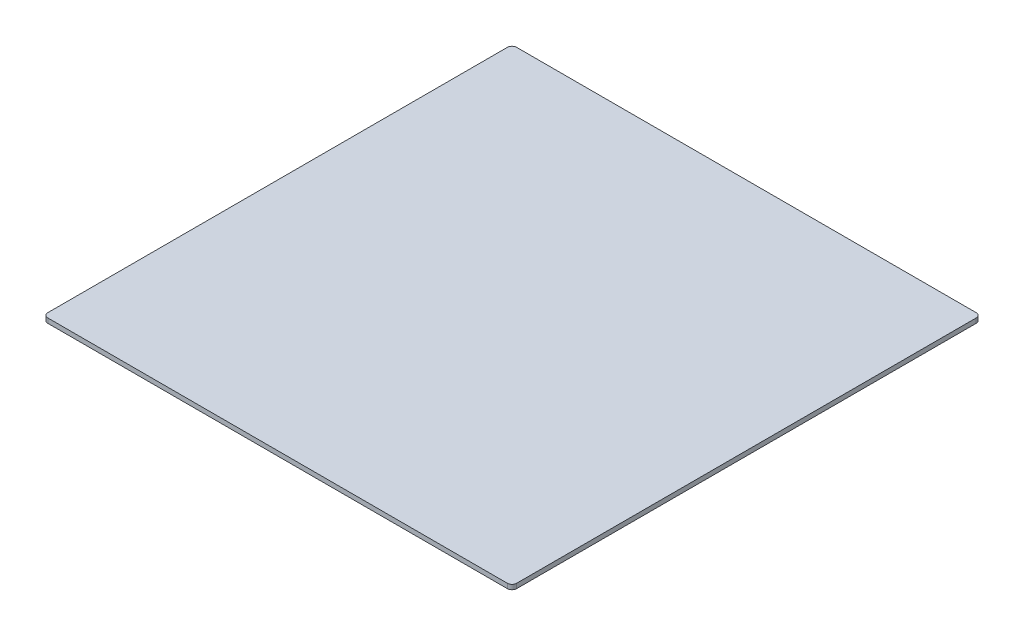
ISO-10303-21;
HEADER;
FILE_DESCRIPTION(('STEP AP214'),'2;1');
FILE_NAME('part.step','',(''),(''),'','','');
FILE_SCHEMA(('AUTOMOTIVE_DESIGN { 1 0 10303 214 1 1 1 1 }'));
ENDSEC;
DATA;
#1=APPLICATION_CONTEXT('core data for automotive mechanical design processes');
#2=APPLICATION_PROTOCOL_DEFINITION('international standard','automotive_design',2000,#1);
#3=PRODUCT_CONTEXT('',#1,'mechanical');
#4=PRODUCT('Part','Part','',(#3));
#5=PRODUCT_RELATED_PRODUCT_CATEGORY('part','',(#4));
#6=PRODUCT_DEFINITION_FORMATION('','',#4);
#7=PRODUCT_DEFINITION_CONTEXT('part definition',#1,'design');
#8=PRODUCT_DEFINITION('design','',#6,#7);
#9=PRODUCT_DEFINITION_SHAPE('','',#8);
#10=(LENGTH_UNIT() NAMED_UNIT(*) SI_UNIT(.MILLI.,.METRE.));
#11=(NAMED_UNIT(*) PLANE_ANGLE_UNIT() SI_UNIT($,.RADIAN.));
#12=(NAMED_UNIT(*) SI_UNIT($,.STERADIAN.) SOLID_ANGLE_UNIT());
#13=UNCERTAINTY_MEASURE_WITH_UNIT(LENGTH_MEASURE(1.E-05),#10,'distance_accuracy_value','');
#14=(GEOMETRIC_REPRESENTATION_CONTEXT(3) GLOBAL_UNCERTAINTY_ASSIGNED_CONTEXT((#13)) GLOBAL_UNIT_ASSIGNED_CONTEXT((#10,
#11,#12)) REPRESENTATION_CONTEXT('',''));
#15=CARTESIAN_POINT('',(0.,0.,0.));
#16=DIRECTION('',(0.,0.,1.));
#17=DIRECTION('',(1.,0.,0.));
#18=AXIS2_PLACEMENT_3D('',#15,#16,#17);
#19=CARTESIAN_POINT('',(58.1949219003437,1.,-20.4453938539141));
#20=DIRECTION('',(0.,-1.,0.));
#21=DIRECTION('',(0.,0.,-1.));
#22=AXIS2_PLACEMENT_3D('',#19,#20,#21);
#23=CYLINDRICAL_SURFACE('',#22,1.);
#24=CARTESIAN_POINT('',(58.1949219003437,0.,-20.4453938539141));
#25=DIRECTION('',(0.,1.,0.));
#26=DIRECTION('',(0.,0.,1.));
#27=AXIS2_PLACEMENT_3D('',#24,#25,#26);
#28=CIRCLE('',#27,1.);
#29=CARTESIAN_POINT('',(58.1949219003437,0.,-19.4453938539141));
#30=VERTEX_POINT('',#29);
#31=CARTESIAN_POINT('',(59.1949219003437,0.,-20.4453938539141));
#32=VERTEX_POINT('',#31);
#33=EDGE_CURVE('E128',#30,#32,#28,.T.);
#34=ORIENTED_EDGE('',*,*,#33,.T.);
#35=DIRECTION('',(0.,-1.,0.));
#36=VECTOR('',#35,1.);
#37=CARTESIAN_POINT('',(59.1949219003437,1.,-20.4453938539141));
#38=LINE('',#37,#36);
#39=CARTESIAN_POINT('',(59.1949219003437,1.,-20.4453938539141));
#40=VERTEX_POINT('',#39);
#41=EDGE_CURVE('E11',#40,#32,#38,.T.);
#42=ORIENTED_EDGE('',*,*,#41,.F.);
#43=CARTESIAN_POINT('',(58.1949219003437,1.,-20.4453938539141));
#44=DIRECTION('',(0.,1.,0.));
#45=DIRECTION('',(0.,0.,1.));
#46=AXIS2_PLACEMENT_3D('',#43,#44,#45);
#47=CIRCLE('',#46,1.);
#48=CARTESIAN_POINT('',(58.1949219003437,1.,-19.4453938539141));
#49=VERTEX_POINT('',#48);
#50=EDGE_CURVE('E142',#49,#40,#47,.T.);
#51=ORIENTED_EDGE('',*,*,#50,.F.);
#52=DIRECTION('',(0.,-1.,0.));
#53=VECTOR('',#52,1.);
#54=CARTESIAN_POINT('',(58.1949219003437,1.,-19.4453938539141));
#55=LINE('',#54,#53);
#56=EDGE_CURVE('E124',#49,#30,#55,.T.);
#57=ORIENTED_EDGE('',*,*,#56,.T.);
#58=EDGE_LOOP('',(#34,#42,#51,#57));
#59=FACE_BOUND('',#58,.T.);
#60=ADVANCED_FACE('F32',(#59),#23,.T.);
#61=CARTESIAN_POINT('',(59.1949219003437,1.,-118.445393853914));
#62=DIRECTION('',(-1.,0.,0.));
#63=DIRECTION('',(0.,0.,1.));
#64=AXIS2_PLACEMENT_3D('',#61,#62,#63);
#65=PLANE('',#64);
#66=DIRECTION('',(0.,0.,-1.));
#67=VECTOR('',#66,1.);
#68=CARTESIAN_POINT('',(59.1949219003437,0.,-118.445393853914));
#69=LINE('',#68,#67);
#70=CARTESIAN_POINT('',(59.1949219003437,0.,-118.445393853914));
#71=VERTEX_POINT('',#70);
#72=EDGE_CURVE('E131',#32,#71,#69,.T.);
#73=ORIENTED_EDGE('',*,*,#72,.T.);
#74=DIRECTION('',(0.,-1.,0.));
#75=VECTOR('',#74,1.);
#76=CARTESIAN_POINT('',(59.1949219003437,1.,-118.445393853914));
#77=LINE('',#76,#75);
#78=CARTESIAN_POINT('',(59.1949219003437,1.,-118.445393853914));
#79=VERTEX_POINT('',#78);
#80=EDGE_CURVE('E40',#79,#71,#77,.T.);
#81=ORIENTED_EDGE('',*,*,#80,.F.);
#82=DIRECTION('',(0.,0.,-1.));
#83=VECTOR('',#82,1.);
#84=CARTESIAN_POINT('',(59.1949219003437,1.,-118.445393853914));
#85=LINE('',#84,#83);
#86=EDGE_CURVE('E91',#40,#79,#85,.T.);
#87=ORIENTED_EDGE('',*,*,#86,.F.);
#88=ORIENTED_EDGE('',*,*,#41,.T.);
#89=EDGE_LOOP('',(#73,#81,#87,#88));
#90=FACE_BOUND('',#89,.T.);
#91=ADVANCED_FACE('F177',(#90),#65,.F.);
#92=CARTESIAN_POINT('',(58.1949219003437,1.,-118.445393853914));
#93=DIRECTION('',(0.,-1.,0.));
#94=DIRECTION('',(0.,0.,-1.));
#95=AXIS2_PLACEMENT_3D('',#92,#93,#94);
#96=CYLINDRICAL_SURFACE('',#95,1.);
#97=CARTESIAN_POINT('',(58.1949219003437,0.,-118.445393853914));
#98=DIRECTION('',(0.,1.,0.));
#99=DIRECTION('',(0.,0.,-1.));
#100=AXIS2_PLACEMENT_3D('',#97,#98,#99);
#101=CIRCLE('',#100,1.);
#102=CARTESIAN_POINT('',(58.1949219003437,0.,-119.445393853914));
#103=VERTEX_POINT('',#102);
#104=EDGE_CURVE('E133',#71,#103,#101,.T.);
#105=ORIENTED_EDGE('',*,*,#104,.T.);
#106=DIRECTION('',(0.,-1.,0.));
#107=VECTOR('',#106,1.);
#108=CARTESIAN_POINT('',(58.1949219003437,1.,-119.445393853914));
#109=LINE('',#108,#107);
#110=CARTESIAN_POINT('',(58.1949219003437,1.,-119.445393853914));
#111=VERTEX_POINT('',#110);
#112=EDGE_CURVE('E149',#111,#103,#109,.T.);
#113=ORIENTED_EDGE('',*,*,#112,.F.);
#114=CARTESIAN_POINT('',(58.1949219003437,1.,-118.445393853914));
#115=DIRECTION('',(0.,1.,0.));
#116=DIRECTION('',(0.,0.,-1.));
#117=AXIS2_PLACEMENT_3D('',#114,#115,#116);
#118=CIRCLE('',#117,1.);
#119=EDGE_CURVE('E157',#79,#111,#118,.T.);
#120=ORIENTED_EDGE('',*,*,#119,.F.);
#121=ORIENTED_EDGE('',*,*,#80,.T.);
#122=EDGE_LOOP('',(#105,#113,#120,#121));
#123=FACE_BOUND('',#122,.T.);
#124=ADVANCED_FACE('F155',(#123),#96,.T.);
#125=CARTESIAN_POINT('',(-39.8050780996563,1.,-119.445393853914));
#126=DIRECTION('',(0.,0.,1.));
#127=DIRECTION('',(1.,0.,0.));
#128=AXIS2_PLACEMENT_3D('',#125,#126,#127);
#129=PLANE('',#128);
#130=DIRECTION('',(-1.,0.,0.));
#131=VECTOR('',#130,1.);
#132=CARTESIAN_POINT('',(-39.8050780996563,0.,-119.445393853914));
#133=LINE('',#132,#131);
#134=CARTESIAN_POINT('',(-39.8050780996563,0.,-119.445393853914));
#135=VERTEX_POINT('',#134);
#136=EDGE_CURVE('E135',#103,#135,#133,.T.);
#137=ORIENTED_EDGE('',*,*,#136,.T.);
#138=DIRECTION('',(0.,-1.,0.));
#139=VECTOR('',#138,1.);
#140=CARTESIAN_POINT('',(-39.8050780996563,1.,-119.445393853914));
#141=LINE('',#140,#139);
#142=CARTESIAN_POINT('',(-39.8050780996563,1.,-119.445393853914));
#143=VERTEX_POINT('',#142);
#144=EDGE_CURVE('E146',#143,#135,#141,.T.);
#145=ORIENTED_EDGE('',*,*,#144,.F.);
#146=DIRECTION('',(-1.,0.,0.));
#147=VECTOR('',#146,1.);
#148=CARTESIAN_POINT('',(-39.8050780996563,1.,-119.445393853914));
#149=LINE('',#148,#147);
#150=EDGE_CURVE('E169',#111,#143,#149,.T.);
#151=ORIENTED_EDGE('',*,*,#150,.F.);
#152=ORIENTED_EDGE('',*,*,#112,.T.);
#153=EDGE_LOOP('',(#137,#145,#151,#152));
#154=FACE_BOUND('',#153,.T.);
#155=ADVANCED_FACE('F165',(#154),#129,.F.);
#156=CARTESIAN_POINT('',(-39.8050780996563,1.,-118.445393853914));
#157=DIRECTION('',(0.,-1.,0.));
#158=DIRECTION('',(0.,0.,-1.));
#159=AXIS2_PLACEMENT_3D('',#156,#157,#158);
#160=CYLINDRICAL_SURFACE('',#159,1.);
#161=CARTESIAN_POINT('',(-39.8050780996563,0.,-118.445393853914));
#162=DIRECTION('',(0.,1.,0.));
#163=DIRECTION('',(0.,0.,1.));
#164=AXIS2_PLACEMENT_3D('',#161,#162,#163);
#165=CIRCLE('',#164,1.);
#166=CARTESIAN_POINT('',(-40.8050780996563,0.,-118.445393853914));
#167=VERTEX_POINT('',#166);
#168=EDGE_CURVE('E137',#135,#167,#165,.T.);
#169=ORIENTED_EDGE('',*,*,#168,.T.);
#170=DIRECTION('',(0.,-1.,0.));
#171=VECTOR('',#170,1.);
#172=CARTESIAN_POINT('',(-40.8050780996563,1.,-118.445393853914));
#173=LINE('',#172,#171);
#174=CARTESIAN_POINT('',(-40.8050780996563,1.,-118.445393853914));
#175=VERTEX_POINT('',#174);
#176=EDGE_CURVE('E119',#175,#167,#173,.T.);
#177=ORIENTED_EDGE('',*,*,#176,.F.);
#178=CARTESIAN_POINT('',(-39.8050780996563,1.,-118.445393853914));
#179=DIRECTION('',(0.,1.,0.));
#180=DIRECTION('',(0.,0.,1.));
#181=AXIS2_PLACEMENT_3D('',#178,#179,#180);
#182=CIRCLE('',#181,1.);
#183=EDGE_CURVE('E110',#143,#175,#182,.T.);
#184=ORIENTED_EDGE('',*,*,#183,.F.);
#185=ORIENTED_EDGE('',*,*,#144,.T.);
#186=EDGE_LOOP('',(#169,#177,#184,#185));
#187=FACE_BOUND('',#186,.T.);
#188=ADVANCED_FACE('F168',(#187),#160,.T.);
#189=CARTESIAN_POINT('',(-40.8050780996563,1.,-118.445393853914));
#190=DIRECTION('',(1.,0.,0.));
#191=DIRECTION('',(0.,0.,-1.));
#192=AXIS2_PLACEMENT_3D('',#189,#190,#191);
#193=PLANE('',#192);
#194=DIRECTION('',(0.,0.,1.));
#195=VECTOR('',#194,1.);
#196=CARTESIAN_POINT('',(-40.8050780996563,0.,-118.445393853914));
#197=LINE('',#196,#195);
#198=CARTESIAN_POINT('',(-40.8050780996563,0.,-20.4453938539141));
#199=VERTEX_POINT('',#198);
#200=EDGE_CURVE('E118',#167,#199,#197,.T.);
#201=ORIENTED_EDGE('',*,*,#200,.T.);
#202=DIRECTION('',(0.,-1.,0.));
#203=VECTOR('',#202,1.);
#204=CARTESIAN_POINT('',(-40.8050780996563,1.,-20.4453938539141));
#205=LINE('',#204,#203);
#206=CARTESIAN_POINT('',(-40.8050780996563,1.,-20.4453938539141));
#207=VERTEX_POINT('',#206);
#208=EDGE_CURVE('E115',#207,#199,#205,.T.);
#209=ORIENTED_EDGE('',*,*,#208,.F.);
#210=DIRECTION('',(0.,0.,1.));
#211=VECTOR('',#210,1.);
#212=CARTESIAN_POINT('',(-40.8050780996563,1.,-118.445393853914));
#213=LINE('',#212,#211);
#214=EDGE_CURVE('E104',#175,#207,#213,.T.);
#215=ORIENTED_EDGE('',*,*,#214,.F.);
#216=ORIENTED_EDGE('',*,*,#176,.T.);
#217=EDGE_LOOP('',(#201,#209,#215,#216));
#218=FACE_BOUND('',#217,.T.);
#219=ADVANCED_FACE('F116',(#218),#193,.F.);
#220=CARTESIAN_POINT('',(-39.8050780996563,1.,-20.4453938539141));
#221=DIRECTION('',(0.,-1.,0.));
#222=DIRECTION('',(0.,0.,-1.));
#223=AXIS2_PLACEMENT_3D('',#220,#221,#222);
#224=CYLINDRICAL_SURFACE('',#223,1.);
#225=CARTESIAN_POINT('',(-39.8050780996563,0.,-20.4453938539141));
#226=DIRECTION('',(0.,1.,0.));
#227=DIRECTION('',(0.,0.,1.));
#228=AXIS2_PLACEMENT_3D('',#225,#226,#227);
#229=CIRCLE('',#228,1.);
#230=CARTESIAN_POINT('',(-39.8050780996563,0.,-19.4453938539141));
#231=VERTEX_POINT('',#230);
#232=EDGE_CURVE('E77',#199,#231,#229,.T.);
#233=ORIENTED_EDGE('',*,*,#232,.T.);
#234=DIRECTION('',(0.,-1.,0.));
#235=VECTOR('',#234,1.);
#236=CARTESIAN_POINT('',(-39.8050780996563,1.,-19.4453938539141));
#237=LINE('',#236,#235);
#238=CARTESIAN_POINT('',(-39.8050780996563,1.,-19.4453938539141));
#239=VERTEX_POINT('',#238);
#240=EDGE_CURVE('E120',#239,#231,#237,.T.);
#241=ORIENTED_EDGE('',*,*,#240,.F.);
#242=CARTESIAN_POINT('',(-39.8050780996563,1.,-20.4453938539141));
#243=DIRECTION('',(0.,1.,0.));
#244=DIRECTION('',(0.,0.,1.));
#245=AXIS2_PLACEMENT_3D('',#242,#243,#244);
#246=CIRCLE('',#245,1.);
#247=EDGE_CURVE('E108',#207,#239,#246,.T.);
#248=ORIENTED_EDGE('',*,*,#247,.F.);
#249=ORIENTED_EDGE('',*,*,#208,.T.);
#250=EDGE_LOOP('',(#233,#241,#248,#249));
#251=FACE_BOUND('',#250,.T.);
#252=ADVANCED_FACE('F122',(#251),#224,.T.);
#253=CARTESIAN_POINT('',(-39.8050780996563,1.,-19.4453938539141));
#254=DIRECTION('',(0.,0.,-1.));
#255=DIRECTION('',(-1.,0.,0.));
#256=AXIS2_PLACEMENT_3D('',#253,#254,#255);
#257=PLANE('',#256);
#258=DIRECTION('',(1.,0.,0.));
#259=VECTOR('',#258,1.);
#260=CARTESIAN_POINT('',(-39.8050780996563,0.,-19.4453938539141));
#261=LINE('',#260,#259);
#262=EDGE_CURVE('E83',#231,#30,#261,.T.);
#263=ORIENTED_EDGE('',*,*,#262,.T.);
#264=ORIENTED_EDGE('',*,*,#56,.F.);
#265=DIRECTION('',(1.,0.,0.));
#266=VECTOR('',#265,1.);
#267=CARTESIAN_POINT('',(-39.8050780996563,1.,-19.4453938539141));
#268=LINE('',#267,#266);
#269=EDGE_CURVE('E48',#239,#49,#268,.T.);
#270=ORIENTED_EDGE('',*,*,#269,.F.);
#271=ORIENTED_EDGE('',*,*,#240,.T.);
#272=EDGE_LOOP('',(#263,#264,#270,#271));
#273=FACE_BOUND('',#272,.T.);
#274=ADVANCED_FACE('F193',(#273),#257,.F.);
#275=CARTESIAN_POINT('',(58.1949219003437,1.,-20.4453938539141));
#276=DIRECTION('',(0.,1.,0.));
#277=DIRECTION('',(0.,0.,1.));
#278=AXIS2_PLACEMENT_3D('',#275,#276,#277);
#279=PLANE('',#278);
#280=ORIENTED_EDGE('',*,*,#50,.T.);
#281=ORIENTED_EDGE('',*,*,#86,.T.);
#282=ORIENTED_EDGE('',*,*,#119,.T.);
#283=ORIENTED_EDGE('',*,*,#150,.T.);
#284=ORIENTED_EDGE('',*,*,#183,.T.);
#285=ORIENTED_EDGE('',*,*,#214,.T.);
#286=ORIENTED_EDGE('',*,*,#247,.T.);
#287=ORIENTED_EDGE('',*,*,#269,.T.);
#288=EDGE_LOOP('',(#280,#281,#282,#283,#284,#285,#286,#287));
#289=FACE_BOUND('',#288,.T.);
#290=ADVANCED_FACE('F106',(#289),#279,.T.);
#291=CARTESIAN_POINT('',(58.1949219003437,0.,-20.4453938539141));
#292=DIRECTION('',(0.,1.,0.));
#293=DIRECTION('',(0.,0.,1.));
#294=AXIS2_PLACEMENT_3D('',#291,#292,#293);
#295=PLANE('',#294);
#296=ORIENTED_EDGE('',*,*,#33,.F.);
#297=ORIENTED_EDGE('',*,*,#262,.F.);
#298=ORIENTED_EDGE('',*,*,#232,.F.);
#299=ORIENTED_EDGE('',*,*,#200,.F.);
#300=ORIENTED_EDGE('',*,*,#168,.F.);
#301=ORIENTED_EDGE('',*,*,#136,.F.);
#302=ORIENTED_EDGE('',*,*,#104,.F.);
#303=ORIENTED_EDGE('',*,*,#72,.F.);
#304=EDGE_LOOP('',(#296,#297,#298,#299,#300,#301,#302,#303));
#305=FACE_BOUND('',#304,.T.);
#306=ADVANCED_FACE('F161',(#305),#295,.F.);
#307=CLOSED_SHELL('',(#60,#91,#124,#155,#188,#219,#252,#274,#290,#306));
#308=MANIFOLD_SOLID_BREP('B2',#307);
#309=ADVANCED_BREP_SHAPE_REPRESENTATION('',(#18,#308),#14);
#310=SHAPE_DEFINITION_REPRESENTATION(#9,#309);
ENDSEC;
END-ISO-10303-21;
